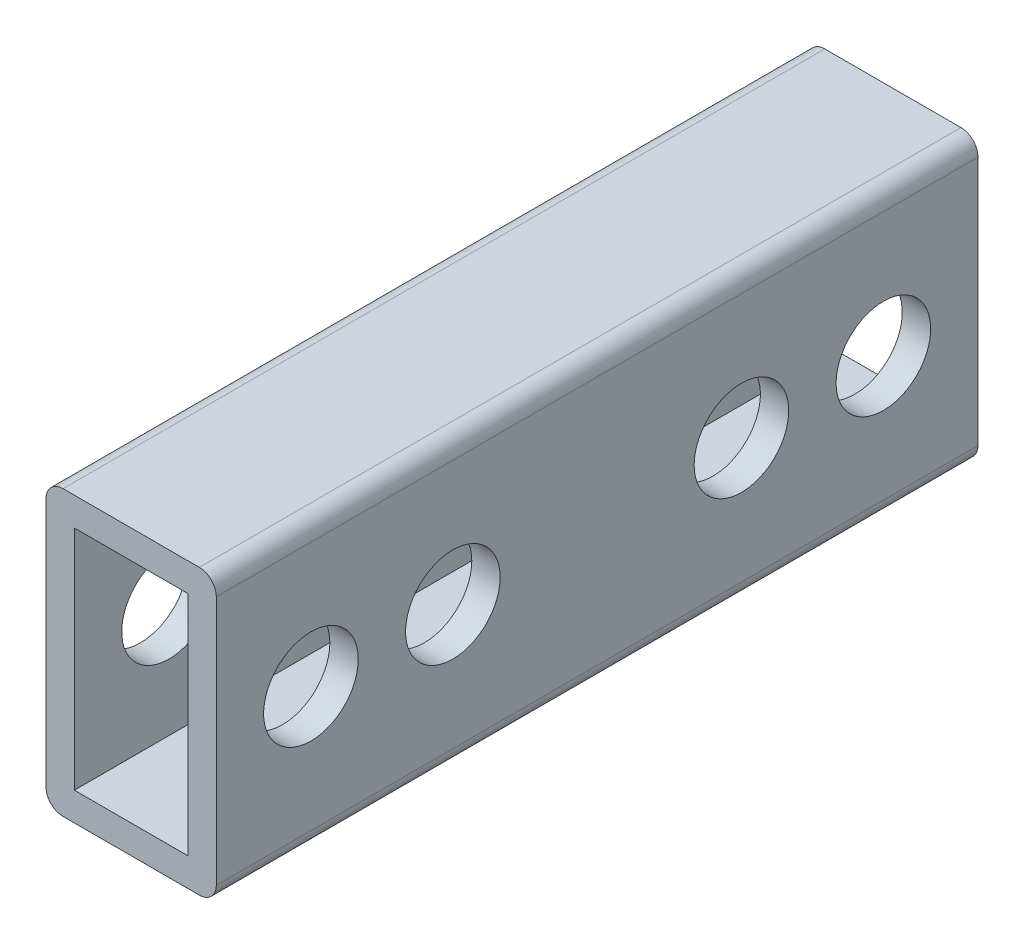
ISO-10303-21;
HEADER;
FILE_DESCRIPTION(('STEP AP214'),'2;1');
FILE_NAME('part.step','',(''),(''),'','','');
FILE_SCHEMA(('AUTOMOTIVE_DESIGN { 1 0 10303 214 1 1 1 1 }'));
ENDSEC;
DATA;
#1=APPLICATION_CONTEXT('core data for automotive mechanical design processes');
#2=APPLICATION_PROTOCOL_DEFINITION('international standard','automotive_design',2000,#1);
#3=PRODUCT_CONTEXT('',#1,'mechanical');
#4=PRODUCT('Part','Part','',(#3));
#5=PRODUCT_RELATED_PRODUCT_CATEGORY('part','',(#4));
#6=PRODUCT_DEFINITION_FORMATION('','',#4);
#7=PRODUCT_DEFINITION_CONTEXT('part definition',#1,'design');
#8=PRODUCT_DEFINITION('design','',#6,#7);
#9=PRODUCT_DEFINITION_SHAPE('','',#8);
#10=(LENGTH_UNIT() NAMED_UNIT(*) SI_UNIT(.MILLI.,.METRE.));
#11=(NAMED_UNIT(*) PLANE_ANGLE_UNIT() SI_UNIT($,.RADIAN.));
#12=(NAMED_UNIT(*) SI_UNIT($,.STERADIAN.) SOLID_ANGLE_UNIT());
#13=UNCERTAINTY_MEASURE_WITH_UNIT(LENGTH_MEASURE(1.E-05),#10,'distance_accuracy_value','');
#14=(GEOMETRIC_REPRESENTATION_CONTEXT(3) GLOBAL_UNCERTAINTY_ASSIGNED_CONTEXT((#13)) GLOBAL_UNIT_ASSIGNED_CONTEXT((#10,
#11,#12)) REPRESENTATION_CONTEXT('',''));
#15=CARTESIAN_POINT('',(0.,0.,0.));
#16=DIRECTION('',(0.,0.,1.));
#17=DIRECTION('',(1.,0.,0.));
#18=AXIS2_PLACEMENT_3D('',#15,#16,#17);
#19=CARTESIAN_POINT('',(0.,0.,80.5));
#20=DIRECTION('',(0.,0.,1.));
#21=DIRECTION('',(1.,0.,0.));
#22=AXIS2_PLACEMENT_3D('',#19,#20,#21);
#23=PLANE('',#22);
#24=DIRECTION('',(0.,-1.,0.));
#25=VECTOR('',#24,1.);
#26=CARTESIAN_POINT('',(-9.,-15.,80.5));
#27=LINE('',#26,#25);
#28=CARTESIAN_POINT('',(-9.,13.2,80.5));
#29=VERTEX_POINT('',#28);
#30=CARTESIAN_POINT('',(-9.,-13.2,80.5));
#31=VERTEX_POINT('',#30);
#32=EDGE_CURVE('E170',#29,#31,#27,.T.);
#33=ORIENTED_EDGE('',*,*,#32,.T.);
#34=CARTESIAN_POINT('',(-7.2,-13.2,80.5));
#35=DIRECTION('',(0.,0.,1.));
#36=DIRECTION('',(1.,0.,0.));
#37=AXIS2_PLACEMENT_3D('',#34,#35,#36);
#38=CIRCLE('',#37,1.8);
#39=CARTESIAN_POINT('',(-7.2,-15.,80.5));
#40=VERTEX_POINT('',#39);
#41=EDGE_CURVE('E229',#31,#40,#38,.T.);
#42=ORIENTED_EDGE('',*,*,#41,.T.);
#43=DIRECTION('',(1.,0.,0.));
#44=VECTOR('',#43,1.);
#45=CARTESIAN_POINT('',(9.,-15.,80.5));
#46=LINE('',#45,#44);
#47=CARTESIAN_POINT('',(7.2,-15.,80.5));
#48=VERTEX_POINT('',#47);
#49=EDGE_CURVE('E173',#40,#48,#46,.T.);
#50=ORIENTED_EDGE('',*,*,#49,.T.);
#51=CARTESIAN_POINT('',(7.2,-13.2,80.5));
#52=DIRECTION('',(0.,0.,1.));
#53=DIRECTION('',(1.,0.,0.));
#54=AXIS2_PLACEMENT_3D('',#51,#52,#53);
#55=CIRCLE('',#54,1.8);
#56=CARTESIAN_POINT('',(9.,-13.2,80.5));
#57=VERTEX_POINT('',#56);
#58=EDGE_CURVE('E227',#48,#57,#55,.T.);
#59=ORIENTED_EDGE('',*,*,#58,.T.);
#60=DIRECTION('',(0.,1.,0.));
#61=VECTOR('',#60,1.);
#62=CARTESIAN_POINT('',(9.,-15.,80.5));
#63=LINE('',#62,#61);
#64=CARTESIAN_POINT('',(9.,13.2,80.5));
#65=VERTEX_POINT('',#64);
#66=EDGE_CURVE('E177',#57,#65,#63,.T.);
#67=ORIENTED_EDGE('',*,*,#66,.T.);
#68=CARTESIAN_POINT('',(7.2,13.2,80.5));
#69=DIRECTION('',(0.,0.,1.));
#70=DIRECTION('',(1.,0.,0.));
#71=AXIS2_PLACEMENT_3D('',#68,#69,#70);
#72=CIRCLE('',#71,1.8);
#73=CARTESIAN_POINT('',(7.2,15.,80.5));
#74=VERTEX_POINT('',#73);
#75=EDGE_CURVE('E57',#65,#74,#72,.T.);
#76=ORIENTED_EDGE('',*,*,#75,.T.);
#77=DIRECTION('',(-1.,0.,0.));
#78=VECTOR('',#77,1.);
#79=CARTESIAN_POINT('',(9.,15.,80.5));
#80=LINE('',#79,#78);
#81=CARTESIAN_POINT('',(-7.2,15.,80.5));
#82=VERTEX_POINT('',#81);
#83=EDGE_CURVE('E179',#74,#82,#80,.T.);
#84=ORIENTED_EDGE('',*,*,#83,.T.);
#85=CARTESIAN_POINT('',(-7.2,13.2,80.5));
#86=DIRECTION('',(0.,0.,1.));
#87=DIRECTION('',(1.,0.,0.));
#88=AXIS2_PLACEMENT_3D('',#85,#86,#87);
#89=CIRCLE('',#88,1.8);
#90=EDGE_CURVE('E224',#82,#29,#89,.T.);
#91=ORIENTED_EDGE('',*,*,#90,.T.);
#92=EDGE_LOOP('',(#33,#42,#50,#59,#67,#76,#84,#91));
#93=FACE_BOUND('',#92,.T.);
#94=DIRECTION('',(1.,0.,0.));
#95=VECTOR('',#94,1.);
#96=CARTESIAN_POINT('',(6.,-12.,80.5));
#97=LINE('',#96,#95);
#98=CARTESIAN_POINT('',(-6.,-12.,80.5));
#99=VERTEX_POINT('',#98);
#100=CARTESIAN_POINT('',(6.,-12.,80.5));
#101=VERTEX_POINT('',#100);
#102=EDGE_CURVE('E137',#99,#101,#97,.T.);
#103=ORIENTED_EDGE('',*,*,#102,.F.);
#104=DIRECTION('',(0.,-1.,0.));
#105=VECTOR('',#104,1.);
#106=CARTESIAN_POINT('',(-6.,-12.,80.5));
#107=LINE('',#106,#105);
#108=CARTESIAN_POINT('',(-6.,12.,80.5));
#109=VERTEX_POINT('',#108);
#110=EDGE_CURVE('E127',#109,#99,#107,.T.);
#111=ORIENTED_EDGE('',*,*,#110,.F.);
#112=DIRECTION('',(-1.,0.,0.));
#113=VECTOR('',#112,1.);
#114=CARTESIAN_POINT('',(6.,12.,80.5));
#115=LINE('',#114,#113);
#116=CARTESIAN_POINT('',(6.,12.,80.5));
#117=VERTEX_POINT('',#116);
#118=EDGE_CURVE('E152',#117,#109,#115,.T.);
#119=ORIENTED_EDGE('',*,*,#118,.F.);
#120=DIRECTION('',(0.,1.,0.));
#121=VECTOR('',#120,1.);
#122=CARTESIAN_POINT('',(6.,-12.,80.5));
#123=LINE('',#122,#121);
#124=EDGE_CURVE('E150',#101,#117,#123,.T.);
#125=ORIENTED_EDGE('',*,*,#124,.F.);
#126=EDGE_LOOP('',(#103,#111,#119,#125));
#127=FACE_BOUND('',#126,.T.);
#128=ADVANCED_FACE('F36',(#93,#127),#23,.T.);
#129=CARTESIAN_POINT('',(0.,0.,0.));
#130=DIRECTION('',(0.,0.,1.));
#131=DIRECTION('',(1.,0.,0.));
#132=AXIS2_PLACEMENT_3D('',#129,#130,#131);
#133=PLANE('',#132);
#134=DIRECTION('',(1.,0.,0.));
#135=VECTOR('',#134,1.);
#136=CARTESIAN_POINT('',(9.,-15.,0.));
#137=LINE('',#136,#135);
#138=CARTESIAN_POINT('',(-7.2,-15.,0.));
#139=VERTEX_POINT('',#138);
#140=CARTESIAN_POINT('',(7.2,-15.,0.));
#141=VERTEX_POINT('',#140);
#142=EDGE_CURVE('E184',#139,#141,#137,.T.);
#143=ORIENTED_EDGE('',*,*,#142,.F.);
#144=CARTESIAN_POINT('',(-7.2,-13.2,0.));
#145=DIRECTION('',(0.,0.,1.));
#146=DIRECTION('',(1.,0.,0.));
#147=AXIS2_PLACEMENT_3D('',#144,#145,#146);
#148=CIRCLE('',#147,1.8);
#149=CARTESIAN_POINT('',(-9.,-13.2,0.));
#150=VERTEX_POINT('',#149);
#151=EDGE_CURVE('E217',#139,#150,#148,.F.);
#152=ORIENTED_EDGE('',*,*,#151,.T.);
#153=DIRECTION('',(0.,-1.,0.));
#154=VECTOR('',#153,1.);
#155=CARTESIAN_POINT('',(-9.,-15.,0.));
#156=LINE('',#155,#154);
#157=CARTESIAN_POINT('',(-9.,13.2,0.));
#158=VERTEX_POINT('',#157);
#159=EDGE_CURVE('E145',#158,#150,#156,.T.);
#160=ORIENTED_EDGE('',*,*,#159,.F.);
#161=CARTESIAN_POINT('',(-7.2,13.2,0.));
#162=DIRECTION('',(0.,0.,1.));
#163=DIRECTION('',(1.,0.,0.));
#164=AXIS2_PLACEMENT_3D('',#161,#162,#163);
#165=CIRCLE('',#164,1.8);
#166=CARTESIAN_POINT('',(-7.2,15.,0.));
#167=VERTEX_POINT('',#166);
#168=EDGE_CURVE('E211',#158,#167,#165,.F.);
#169=ORIENTED_EDGE('',*,*,#168,.T.);
#170=DIRECTION('',(-1.,0.,0.));
#171=VECTOR('',#170,1.);
#172=CARTESIAN_POINT('',(9.,15.,0.));
#173=LINE('',#172,#171);
#174=CARTESIAN_POINT('',(7.2,15.,0.));
#175=VERTEX_POINT('',#174);
#176=EDGE_CURVE('E174',#175,#167,#173,.T.);
#177=ORIENTED_EDGE('',*,*,#176,.F.);
#178=CARTESIAN_POINT('',(7.2,13.2,0.));
#179=DIRECTION('',(0.,0.,1.));
#180=DIRECTION('',(1.,0.,0.));
#181=AXIS2_PLACEMENT_3D('',#178,#179,#180);
#182=CIRCLE('',#181,1.8);
#183=CARTESIAN_POINT('',(9.,13.2,0.));
#184=VERTEX_POINT('',#183);
#185=EDGE_CURVE('E213',#175,#184,#182,.F.);
#186=ORIENTED_EDGE('',*,*,#185,.T.);
#187=DIRECTION('',(0.,1.,0.));
#188=VECTOR('',#187,1.);
#189=CARTESIAN_POINT('',(9.,-15.,0.));
#190=LINE('',#189,#188);
#191=CARTESIAN_POINT('',(9.,-13.2,0.));
#192=VERTEX_POINT('',#191);
#193=EDGE_CURVE('E187',#192,#184,#190,.T.);
#194=ORIENTED_EDGE('',*,*,#193,.F.);
#195=CARTESIAN_POINT('',(7.2,-13.2,0.));
#196=DIRECTION('',(0.,0.,1.));
#197=DIRECTION('',(1.,0.,0.));
#198=AXIS2_PLACEMENT_3D('',#195,#196,#197);
#199=CIRCLE('',#198,1.8);
#200=EDGE_CURVE('E215',#192,#141,#199,.F.);
#201=ORIENTED_EDGE('',*,*,#200,.T.);
#202=EDGE_LOOP('',(#143,#152,#160,#169,#177,#186,#194,#201));
#203=FACE_BOUND('',#202,.T.);
#204=DIRECTION('',(0.,-1.,0.));
#205=VECTOR('',#204,1.);
#206=CARTESIAN_POINT('',(-6.,-12.,0.));
#207=LINE('',#206,#205);
#208=CARTESIAN_POINT('',(-6.,12.,0.));
#209=VERTEX_POINT('',#208);
#210=CARTESIAN_POINT('',(-6.,-12.,0.));
#211=VERTEX_POINT('',#210);
#212=EDGE_CURVE('E157',#209,#211,#207,.T.);
#213=ORIENTED_EDGE('',*,*,#212,.T.);
#214=DIRECTION('',(1.,0.,0.));
#215=VECTOR('',#214,1.);
#216=CARTESIAN_POINT('',(6.,-12.,0.));
#217=LINE('',#216,#215);
#218=CARTESIAN_POINT('',(6.,-12.,0.));
#219=VERTEX_POINT('',#218);
#220=EDGE_CURVE('E144',#211,#219,#217,.T.);
#221=ORIENTED_EDGE('',*,*,#220,.T.);
#222=DIRECTION('',(0.,1.,0.));
#223=VECTOR('',#222,1.);
#224=CARTESIAN_POINT('',(6.,-12.,0.));
#225=LINE('',#224,#223);
#226=CARTESIAN_POINT('',(6.,12.,0.));
#227=VERTEX_POINT('',#226);
#228=EDGE_CURVE('E161',#219,#227,#225,.T.);
#229=ORIENTED_EDGE('',*,*,#228,.T.);
#230=DIRECTION('',(-1.,0.,0.));
#231=VECTOR('',#230,1.);
#232=CARTESIAN_POINT('',(6.,12.,0.));
#233=LINE('',#232,#231);
#234=EDGE_CURVE('E138',#227,#209,#233,.T.);
#235=ORIENTED_EDGE('',*,*,#234,.T.);
#236=EDGE_LOOP('',(#213,#221,#229,#235));
#237=FACE_BOUND('',#236,.T.);
#238=ADVANCED_FACE('F245',(#203,#237),#133,.F.);
#239=CARTESIAN_POINT('',(-9.,-15.,80.5));
#240=DIRECTION('',(1.,0.,0.));
#241=DIRECTION('',(0.,0.,-1.));
#242=AXIS2_PLACEMENT_3D('',#239,#240,#241);
#243=PLANE('',#242);
#244=CARTESIAN_POINT('',(-9.,0.,70.5));
#245=DIRECTION('',(1.,0.,0.));
#246=DIRECTION('',(0.,0.,-1.));
#247=AXIS2_PLACEMENT_3D('',#244,#245,#246);
#248=CIRCLE('',#247,4.99999999999999);
#249=CARTESIAN_POINT('',(-9.,0.,65.5));
#250=VERTEX_POINT('',#249);
#251=EDGE_CURVE('E195',#250,#250,#248,.T.);
#252=ORIENTED_EDGE('',*,*,#251,.T.);
#253=EDGE_LOOP('',(#252));
#254=FACE_BOUND('',#253,.T.);
#255=CARTESIAN_POINT('',(-9.,0.,55.5));
#256=DIRECTION('',(1.,0.,0.));
#257=DIRECTION('',(0.,0.,-1.));
#258=AXIS2_PLACEMENT_3D('',#255,#256,#257);
#259=CIRCLE('',#258,4.99999999999999);
#260=CARTESIAN_POINT('',(-9.,0.,50.5));
#261=VERTEX_POINT('',#260);
#262=EDGE_CURVE('E303',#261,#261,#259,.T.);
#263=ORIENTED_EDGE('',*,*,#262,.T.);
#264=EDGE_LOOP('',(#263));
#265=FACE_BOUND('',#264,.T.);
#266=CARTESIAN_POINT('',(-9.,0.,25.));
#267=DIRECTION('',(1.,0.,0.));
#268=DIRECTION('',(0.,0.,1.));
#269=AXIS2_PLACEMENT_3D('',#266,#267,#268);
#270=CIRCLE('',#269,4.99999999999999);
#271=CARTESIAN_POINT('',(-9.,0.,30.));
#272=VERTEX_POINT('',#271);
#273=EDGE_CURVE('E307',#272,#272,#270,.T.);
#274=ORIENTED_EDGE('',*,*,#273,.T.);
#275=EDGE_LOOP('',(#274));
#276=FACE_BOUND('',#275,.T.);
#277=CARTESIAN_POINT('',(-9.,0.,10.));
#278=DIRECTION('',(1.,0.,0.));
#279=DIRECTION('',(0.,0.,1.));
#280=AXIS2_PLACEMENT_3D('',#277,#278,#279);
#281=CIRCLE('',#280,4.99999999999999);
#282=CARTESIAN_POINT('',(-9.,0.,15.));
#283=VERTEX_POINT('',#282);
#284=EDGE_CURVE('E310',#283,#283,#281,.T.);
#285=ORIENTED_EDGE('',*,*,#284,.T.);
#286=EDGE_LOOP('',(#285));
#287=FACE_BOUND('',#286,.T.);
#288=ORIENTED_EDGE('',*,*,#159,.T.);
#289=DIRECTION('',(0.,0.,-1.));
#290=VECTOR('',#289,1.);
#291=CARTESIAN_POINT('',(-9.,-13.2,80.5));
#292=LINE('',#291,#290);
#293=EDGE_CURVE('E222',#150,#31,#292,.F.);
#294=ORIENTED_EDGE('',*,*,#293,.T.);
#295=ORIENTED_EDGE('',*,*,#32,.F.);
#296=DIRECTION('',(0.,0.,-1.));
#297=VECTOR('',#296,1.);
#298=CARTESIAN_POINT('',(-9.,13.2,80.5));
#299=LINE('',#298,#297);
#300=EDGE_CURVE('E219',#29,#158,#299,.T.);
#301=ORIENTED_EDGE('',*,*,#300,.T.);
#302=EDGE_LOOP('',(#288,#294,#295,#301));
#303=FACE_BOUND('',#302,.T.);
#304=ADVANCED_FACE('F258',(#254,#265,#276,#287,#303),#243,.F.);
#305=CARTESIAN_POINT('',(9.,-15.,80.5));
#306=DIRECTION('',(0.,1.,0.));
#307=DIRECTION('',(0.,0.,1.));
#308=AXIS2_PLACEMENT_3D('',#305,#306,#307);
#309=PLANE('',#308);
#310=ORIENTED_EDGE('',*,*,#49,.F.);
#311=DIRECTION('',(0.,0.,-1.));
#312=VECTOR('',#311,1.);
#313=CARTESIAN_POINT('',(-7.2,-15.,80.5));
#314=LINE('',#313,#312);
#315=EDGE_CURVE('E208',#40,#139,#314,.T.);
#316=ORIENTED_EDGE('',*,*,#315,.T.);
#317=ORIENTED_EDGE('',*,*,#142,.T.);
#318=DIRECTION('',(0.,0.,-1.));
#319=VECTOR('',#318,1.);
#320=CARTESIAN_POINT('',(7.2,-15.,80.5));
#321=LINE('',#320,#319);
#322=EDGE_CURVE('E181',#141,#48,#321,.F.);
#323=ORIENTED_EDGE('',*,*,#322,.T.);
#324=EDGE_LOOP('',(#310,#316,#317,#323));
#325=FACE_BOUND('',#324,.T.);
#326=ADVANCED_FACE('F266',(#325),#309,.F.);
#327=CARTESIAN_POINT('',(9.,-15.,80.5));
#328=DIRECTION('',(-1.,0.,0.));
#329=DIRECTION('',(0.,0.,1.));
#330=AXIS2_PLACEMENT_3D('',#327,#328,#329);
#331=PLANE('',#330);
#332=CARTESIAN_POINT('',(9.,0.,70.5));
#333=DIRECTION('',(1.,0.,0.));
#334=DIRECTION('',(0.,0.,-1.));
#335=AXIS2_PLACEMENT_3D('',#332,#333,#334);
#336=CIRCLE('',#335,4.99999999999999);
#337=CARTESIAN_POINT('',(9.,0.,65.5));
#338=VERTEX_POINT('',#337);
#339=EDGE_CURVE('E394',#338,#338,#336,.T.);
#340=ORIENTED_EDGE('',*,*,#339,.F.);
#341=EDGE_LOOP('',(#340));
#342=FACE_BOUND('',#341,.T.);
#343=CARTESIAN_POINT('',(9.,0.,55.5));
#344=DIRECTION('',(1.,0.,0.));
#345=DIRECTION('',(0.,0.,-1.));
#346=AXIS2_PLACEMENT_3D('',#343,#344,#345);
#347=CIRCLE('',#346,4.99999999999999);
#348=CARTESIAN_POINT('',(9.,0.,50.5));
#349=VERTEX_POINT('',#348);
#350=EDGE_CURVE('E389',#349,#349,#347,.T.);
#351=ORIENTED_EDGE('',*,*,#350,.F.);
#352=EDGE_LOOP('',(#351));
#353=FACE_BOUND('',#352,.T.);
#354=CARTESIAN_POINT('',(9.,0.,25.));
#355=DIRECTION('',(1.,0.,0.));
#356=DIRECTION('',(0.,0.,1.));
#357=AXIS2_PLACEMENT_3D('',#354,#355,#356);
#358=CIRCLE('',#357,4.99999999999999);
#359=CARTESIAN_POINT('',(9.,0.,30.));
#360=VERTEX_POINT('',#359);
#361=EDGE_CURVE('E386',#360,#360,#358,.T.);
#362=ORIENTED_EDGE('',*,*,#361,.F.);
#363=EDGE_LOOP('',(#362));
#364=FACE_BOUND('',#363,.T.);
#365=CARTESIAN_POINT('',(9.,0.,10.));
#366=DIRECTION('',(1.,0.,0.));
#367=DIRECTION('',(0.,0.,1.));
#368=AXIS2_PLACEMENT_3D('',#365,#366,#367);
#369=CIRCLE('',#368,4.99999999999999);
#370=CARTESIAN_POINT('',(9.,0.,15.));
#371=VERTEX_POINT('',#370);
#372=EDGE_CURVE('E312',#371,#371,#369,.T.);
#373=ORIENTED_EDGE('',*,*,#372,.F.);
#374=EDGE_LOOP('',(#373));
#375=FACE_BOUND('',#374,.T.);
#376=ORIENTED_EDGE('',*,*,#66,.F.);
#377=DIRECTION('',(0.,0.,-1.));
#378=VECTOR('',#377,1.);
#379=CARTESIAN_POINT('',(9.,-13.2,80.5));
#380=LINE('',#379,#378);
#381=EDGE_CURVE('E233',#57,#192,#380,.T.);
#382=ORIENTED_EDGE('',*,*,#381,.T.);
#383=ORIENTED_EDGE('',*,*,#193,.T.);
#384=DIRECTION('',(0.,0.,-1.));
#385=VECTOR('',#384,1.);
#386=CARTESIAN_POINT('',(9.,13.2,80.5));
#387=LINE('',#386,#385);
#388=EDGE_CURVE('E231',#184,#65,#387,.F.);
#389=ORIENTED_EDGE('',*,*,#388,.T.);
#390=EDGE_LOOP('',(#376,#382,#383,#389));
#391=FACE_BOUND('',#390,.T.);
#392=ADVANCED_FACE('F239',(#342,#353,#364,#375,#391),#331,.F.);
#393=CARTESIAN_POINT('',(9.,15.,80.5));
#394=DIRECTION('',(0.,-1.,0.));
#395=DIRECTION('',(0.,0.,-1.));
#396=AXIS2_PLACEMENT_3D('',#393,#394,#395);
#397=PLANE('',#396);
#398=ORIENTED_EDGE('',*,*,#83,.F.);
#399=DIRECTION('',(0.,0.,-1.));
#400=VECTOR('',#399,1.);
#401=CARTESIAN_POINT('',(7.2,15.,80.5));
#402=LINE('',#401,#400);
#403=EDGE_CURVE('E11',#74,#175,#402,.T.);
#404=ORIENTED_EDGE('',*,*,#403,.T.);
#405=ORIENTED_EDGE('',*,*,#176,.T.);
#406=DIRECTION('',(0.,0.,-1.));
#407=VECTOR('',#406,1.);
#408=CARTESIAN_POINT('',(-7.2,15.,80.5));
#409=LINE('',#408,#407);
#410=EDGE_CURVE('E44',#167,#82,#409,.F.);
#411=ORIENTED_EDGE('',*,*,#410,.T.);
#412=EDGE_LOOP('',(#398,#404,#405,#411));
#413=FACE_BOUND('',#412,.T.);
#414=ADVANCED_FACE('F251',(#413),#397,.F.);
#415=CARTESIAN_POINT('',(-6.,-12.,80.5));
#416=DIRECTION('',(1.,0.,0.));
#417=DIRECTION('',(0.,0.,-1.));
#418=AXIS2_PLACEMENT_3D('',#415,#416,#417);
#419=PLANE('',#418);
#420=CARTESIAN_POINT('',(-6.,0.,70.5));
#421=DIRECTION('',(1.,0.,0.));
#422=DIRECTION('',(0.,0.,-1.));
#423=AXIS2_PLACEMENT_3D('',#420,#421,#422);
#424=CIRCLE('',#423,4.99999999999999);
#425=CARTESIAN_POINT('',(-6.,0.,65.5));
#426=VERTEX_POINT('',#425);
#427=EDGE_CURVE('E159',#426,#426,#424,.T.);
#428=ORIENTED_EDGE('',*,*,#427,.F.);
#429=EDGE_LOOP('',(#428));
#430=FACE_BOUND('',#429,.T.);
#431=CARTESIAN_POINT('',(-6.,0.,55.5));
#432=DIRECTION('',(1.,0.,0.));
#433=DIRECTION('',(0.,0.,-1.));
#434=AXIS2_PLACEMENT_3D('',#431,#432,#433);
#435=CIRCLE('',#434,4.99999999999999);
#436=CARTESIAN_POINT('',(-6.,0.,50.5));
#437=VERTEX_POINT('',#436);
#438=EDGE_CURVE('E203',#437,#437,#435,.T.);
#439=ORIENTED_EDGE('',*,*,#438,.F.);
#440=EDGE_LOOP('',(#439));
#441=FACE_BOUND('',#440,.T.);
#442=CARTESIAN_POINT('',(-6.,0.,25.));
#443=DIRECTION('',(1.,0.,0.));
#444=DIRECTION('',(0.,0.,-1.));
#445=AXIS2_PLACEMENT_3D('',#442,#443,#444);
#446=CIRCLE('',#445,4.99999999999999);
#447=CARTESIAN_POINT('',(-6.,0.,20.));
#448=VERTEX_POINT('',#447);
#449=EDGE_CURVE('E199',#448,#448,#446,.T.);
#450=ORIENTED_EDGE('',*,*,#449,.F.);
#451=EDGE_LOOP('',(#450));
#452=FACE_BOUND('',#451,.T.);
#453=CARTESIAN_POINT('',(-6.,0.,10.));
#454=DIRECTION('',(1.,0.,0.));
#455=DIRECTION('',(0.,0.,-1.));
#456=AXIS2_PLACEMENT_3D('',#453,#454,#455);
#457=CIRCLE('',#456,4.99999999999999);
#458=CARTESIAN_POINT('',(-6.,0.,5.00000000000002));
#459=VERTEX_POINT('',#458);
#460=EDGE_CURVE('E194',#459,#459,#457,.T.);
#461=ORIENTED_EDGE('',*,*,#460,.F.);
#462=EDGE_LOOP('',(#461));
#463=FACE_BOUND('',#462,.T.);
#464=ORIENTED_EDGE('',*,*,#212,.F.);
#465=DIRECTION('',(0.,0.,-1.));
#466=VECTOR('',#465,1.);
#467=CARTESIAN_POINT('',(-6.,12.,80.5));
#468=LINE('',#467,#466);
#469=EDGE_CURVE('E133',#109,#209,#468,.T.);
#470=ORIENTED_EDGE('',*,*,#469,.F.);
#471=ORIENTED_EDGE('',*,*,#110,.T.);
#472=DIRECTION('',(0.,0.,-1.));
#473=VECTOR('',#472,1.);
#474=CARTESIAN_POINT('',(-6.,-12.,80.5));
#475=LINE('',#474,#473);
#476=EDGE_CURVE('E130',#99,#211,#475,.T.);
#477=ORIENTED_EDGE('',*,*,#476,.T.);
#478=EDGE_LOOP('',(#464,#470,#471,#477));
#479=FACE_BOUND('',#478,.T.);
#480=ADVANCED_FACE('F129',(#430,#441,#452,#463,#479),#419,.T.);
#481=CARTESIAN_POINT('',(6.,-12.,80.5));
#482=DIRECTION('',(0.,1.,0.));
#483=DIRECTION('',(0.,0.,1.));
#484=AXIS2_PLACEMENT_3D('',#481,#482,#483);
#485=PLANE('',#484);
#486=ORIENTED_EDGE('',*,*,#220,.F.);
#487=ORIENTED_EDGE('',*,*,#476,.F.);
#488=ORIENTED_EDGE('',*,*,#102,.T.);
#489=DIRECTION('',(0.,0.,-1.));
#490=VECTOR('',#489,1.);
#491=CARTESIAN_POINT('',(6.,-12.,80.5));
#492=LINE('',#491,#490);
#493=EDGE_CURVE('E146',#101,#219,#492,.T.);
#494=ORIENTED_EDGE('',*,*,#493,.T.);
#495=EDGE_LOOP('',(#486,#487,#488,#494));
#496=FACE_BOUND('',#495,.T.);
#497=ADVANCED_FACE('F141',(#496),#485,.T.);
#498=CARTESIAN_POINT('',(6.,-12.,80.5));
#499=DIRECTION('',(-1.,0.,0.));
#500=DIRECTION('',(0.,0.,1.));
#501=AXIS2_PLACEMENT_3D('',#498,#499,#500);
#502=PLANE('',#501);
#503=CARTESIAN_POINT('',(6.,0.,70.5));
#504=DIRECTION('',(-1.,0.,0.));
#505=DIRECTION('',(0.,0.,1.));
#506=AXIS2_PLACEMENT_3D('',#503,#504,#505);
#507=CIRCLE('',#506,4.99999999999999);
#508=CARTESIAN_POINT('',(6.,0.,75.5));
#509=VERTEX_POINT('',#508);
#510=EDGE_CURVE('E204',#509,#509,#507,.T.);
#511=ORIENTED_EDGE('',*,*,#510,.F.);
#512=EDGE_LOOP('',(#511));
#513=FACE_BOUND('',#512,.T.);
#514=CARTESIAN_POINT('',(6.,0.,55.5));
#515=DIRECTION('',(-1.,0.,0.));
#516=DIRECTION('',(0.,0.,1.));
#517=AXIS2_PLACEMENT_3D('',#514,#515,#516);
#518=CIRCLE('',#517,4.99999999999999);
#519=CARTESIAN_POINT('',(6.,0.,60.5));
#520=VERTEX_POINT('',#519);
#521=EDGE_CURVE('E200',#520,#520,#518,.T.);
#522=ORIENTED_EDGE('',*,*,#521,.F.);
#523=EDGE_LOOP('',(#522));
#524=FACE_BOUND('',#523,.T.);
#525=CARTESIAN_POINT('',(6.,0.,25.));
#526=DIRECTION('',(-1.,0.,0.));
#527=DIRECTION('',(0.,0.,1.));
#528=AXIS2_PLACEMENT_3D('',#525,#526,#527);
#529=CIRCLE('',#528,4.99999999999999);
#530=CARTESIAN_POINT('',(6.,0.,30.));
#531=VERTEX_POINT('',#530);
#532=EDGE_CURVE('E196',#531,#531,#529,.T.);
#533=ORIENTED_EDGE('',*,*,#532,.F.);
#534=EDGE_LOOP('',(#533));
#535=FACE_BOUND('',#534,.T.);
#536=CARTESIAN_POINT('',(6.,0.,10.));
#537=DIRECTION('',(-1.,0.,0.));
#538=DIRECTION('',(0.,0.,1.));
#539=AXIS2_PLACEMENT_3D('',#536,#537,#538);
#540=CIRCLE('',#539,4.99999999999999);
#541=CARTESIAN_POINT('',(6.,0.,15.));
#542=VERTEX_POINT('',#541);
#543=EDGE_CURVE('E191',#542,#542,#540,.T.);
#544=ORIENTED_EDGE('',*,*,#543,.F.);
#545=EDGE_LOOP('',(#544));
#546=FACE_BOUND('',#545,.T.);
#547=ORIENTED_EDGE('',*,*,#228,.F.);
#548=ORIENTED_EDGE('',*,*,#493,.F.);
#549=ORIENTED_EDGE('',*,*,#124,.T.);
#550=DIRECTION('',(0.,0.,-1.));
#551=VECTOR('',#550,1.);
#552=CARTESIAN_POINT('',(6.,12.,80.5));
#553=LINE('',#552,#551);
#554=EDGE_CURVE('E167',#117,#227,#553,.T.);
#555=ORIENTED_EDGE('',*,*,#554,.T.);
#556=EDGE_LOOP('',(#547,#548,#549,#555));
#557=FACE_BOUND('',#556,.T.);
#558=ADVANCED_FACE('F362',(#513,#524,#535,#546,#557),#502,.T.);
#559=CARTESIAN_POINT('',(6.,12.,80.5));
#560=DIRECTION('',(0.,-1.,0.));
#561=DIRECTION('',(0.,0.,-1.));
#562=AXIS2_PLACEMENT_3D('',#559,#560,#561);
#563=PLANE('',#562);
#564=ORIENTED_EDGE('',*,*,#234,.F.);
#565=ORIENTED_EDGE('',*,*,#554,.F.);
#566=ORIENTED_EDGE('',*,*,#118,.T.);
#567=ORIENTED_EDGE('',*,*,#469,.T.);
#568=EDGE_LOOP('',(#564,#565,#566,#567));
#569=FACE_BOUND('',#568,.T.);
#570=ADVANCED_FACE('F355',(#569),#563,.T.);
#571=CARTESIAN_POINT('',(-9.,0.,10.));
#572=DIRECTION('',(1.,0.,0.));
#573=DIRECTION('',(0.,0.,-1.));
#574=AXIS2_PLACEMENT_3D('',#571,#572,#573);
#575=CYLINDRICAL_SURFACE('',#574,4.99999999999999);
#576=ORIENTED_EDGE('',*,*,#543,.T.);
#577=EDGE_LOOP('',(#576));
#578=FACE_BOUND('',#577,.T.);
#579=ORIENTED_EDGE('',*,*,#372,.T.);
#580=EDGE_LOOP('',(#579));
#581=FACE_BOUND('',#580,.T.);
#582=ADVANCED_FACE('F341',(#578,#581),#575,.F.);
#583=CARTESIAN_POINT('',(-9.,0.,25.));
#584=DIRECTION('',(1.,0.,0.));
#585=DIRECTION('',(0.,0.,-1.));
#586=AXIS2_PLACEMENT_3D('',#583,#584,#585);
#587=CYLINDRICAL_SURFACE('',#586,4.99999999999999);
#588=ORIENTED_EDGE('',*,*,#532,.T.);
#589=EDGE_LOOP('',(#588));
#590=FACE_BOUND('',#589,.T.);
#591=ORIENTED_EDGE('',*,*,#361,.T.);
#592=EDGE_LOOP('',(#591));
#593=FACE_BOUND('',#592,.T.);
#594=ADVANCED_FACE('F349',(#590,#593),#587,.F.);
#595=CARTESIAN_POINT('',(-9.,0.,55.5));
#596=DIRECTION('',(1.,0.,0.));
#597=DIRECTION('',(0.,0.,-1.));
#598=AXIS2_PLACEMENT_3D('',#595,#596,#597);
#599=CYLINDRICAL_SURFACE('',#598,4.99999999999999);
#600=ORIENTED_EDGE('',*,*,#521,.T.);
#601=EDGE_LOOP('',(#600));
#602=FACE_BOUND('',#601,.T.);
#603=ORIENTED_EDGE('',*,*,#350,.T.);
#604=EDGE_LOOP('',(#603));
#605=FACE_BOUND('',#604,.T.);
#606=ADVANCED_FACE('F350',(#602,#605),#599,.F.);
#607=CARTESIAN_POINT('',(-9.,0.,70.5));
#608=DIRECTION('',(1.,0.,0.));
#609=DIRECTION('',(0.,0.,-1.));
#610=AXIS2_PLACEMENT_3D('',#607,#608,#609);
#611=CYLINDRICAL_SURFACE('',#610,4.99999999999999);
#612=ORIENTED_EDGE('',*,*,#510,.T.);
#613=EDGE_LOOP('',(#612));
#614=FACE_BOUND('',#613,.T.);
#615=ORIENTED_EDGE('',*,*,#339,.T.);
#616=EDGE_LOOP('',(#615));
#617=FACE_BOUND('',#616,.T.);
#618=ADVANCED_FACE('F339',(#614,#617),#611,.F.);
#619=ORIENTED_EDGE('',*,*,#460,.T.);
#620=EDGE_LOOP('',(#619));
#621=FACE_BOUND('',#620,.T.);
#622=ORIENTED_EDGE('',*,*,#284,.F.);
#623=EDGE_LOOP('',(#622));
#624=FACE_BOUND('',#623,.T.);
#625=ADVANCED_FACE('F336',(#621,#624),#575,.F.);
#626=ORIENTED_EDGE('',*,*,#449,.T.);
#627=EDGE_LOOP('',(#626));
#628=FACE_BOUND('',#627,.T.);
#629=ORIENTED_EDGE('',*,*,#273,.F.);
#630=EDGE_LOOP('',(#629));
#631=FACE_BOUND('',#630,.T.);
#632=ADVANCED_FACE('F338',(#628,#631),#587,.F.);
#633=ORIENTED_EDGE('',*,*,#438,.T.);
#634=EDGE_LOOP('',(#633));
#635=FACE_BOUND('',#634,.T.);
#636=ORIENTED_EDGE('',*,*,#262,.F.);
#637=EDGE_LOOP('',(#636));
#638=FACE_BOUND('',#637,.T.);
#639=ADVANCED_FACE('F346',(#635,#638),#599,.F.);
#640=ORIENTED_EDGE('',*,*,#427,.T.);
#641=EDGE_LOOP('',(#640));
#642=FACE_BOUND('',#641,.T.);
#643=ORIENTED_EDGE('',*,*,#251,.F.);
#644=EDGE_LOOP('',(#643));
#645=FACE_BOUND('',#644,.T.);
#646=ADVANCED_FACE('F275',(#642,#645),#611,.F.);
#647=CARTESIAN_POINT('',(-7.2,-13.2,80.5));
#648=DIRECTION('',(0.,0.,-1.));
#649=DIRECTION('',(-1.,0.,0.));
#650=AXIS2_PLACEMENT_3D('',#647,#648,#649);
#651=CYLINDRICAL_SURFACE('',#650,1.8);
#652=ORIENTED_EDGE('',*,*,#41,.F.);
#653=ORIENTED_EDGE('',*,*,#293,.F.);
#654=ORIENTED_EDGE('',*,*,#151,.F.);
#655=ORIENTED_EDGE('',*,*,#315,.F.);
#656=EDGE_LOOP('',(#652,#653,#654,#655));
#657=FACE_BOUND('',#656,.T.);
#658=ADVANCED_FACE('F263',(#657),#651,.T.);
#659=CARTESIAN_POINT('',(7.2,-13.2,80.5));
#660=DIRECTION('',(0.,0.,-1.));
#661=DIRECTION('',(-1.,0.,0.));
#662=AXIS2_PLACEMENT_3D('',#659,#660,#661);
#663=CYLINDRICAL_SURFACE('',#662,1.8);
#664=ORIENTED_EDGE('',*,*,#58,.F.);
#665=ORIENTED_EDGE('',*,*,#322,.F.);
#666=ORIENTED_EDGE('',*,*,#200,.F.);
#667=ORIENTED_EDGE('',*,*,#381,.F.);
#668=EDGE_LOOP('',(#664,#665,#666,#667));
#669=FACE_BOUND('',#668,.T.);
#670=ADVANCED_FACE('F268',(#669),#663,.T.);
#671=CARTESIAN_POINT('',(7.2,13.2,80.5));
#672=DIRECTION('',(0.,0.,-1.));
#673=DIRECTION('',(-1.,0.,0.));
#674=AXIS2_PLACEMENT_3D('',#671,#672,#673);
#675=CYLINDRICAL_SURFACE('',#674,1.8);
#676=ORIENTED_EDGE('',*,*,#75,.F.);
#677=ORIENTED_EDGE('',*,*,#388,.F.);
#678=ORIENTED_EDGE('',*,*,#185,.F.);
#679=ORIENTED_EDGE('',*,*,#403,.F.);
#680=EDGE_LOOP('',(#676,#677,#678,#679));
#681=FACE_BOUND('',#680,.T.);
#682=ADVANCED_FACE('F250',(#681),#675,.T.);
#683=CARTESIAN_POINT('',(-7.2,13.2,80.5));
#684=DIRECTION('',(0.,0.,-1.));
#685=DIRECTION('',(-1.,0.,0.));
#686=AXIS2_PLACEMENT_3D('',#683,#684,#685);
#687=CYLINDRICAL_SURFACE('',#686,1.8);
#688=ORIENTED_EDGE('',*,*,#90,.F.);
#689=ORIENTED_EDGE('',*,*,#410,.F.);
#690=ORIENTED_EDGE('',*,*,#168,.F.);
#691=ORIENTED_EDGE('',*,*,#300,.F.);
#692=EDGE_LOOP('',(#688,#689,#690,#691));
#693=FACE_BOUND('',#692,.T.);
#694=ADVANCED_FACE('F38',(#693),#687,.T.);
#695=CLOSED_SHELL('',(#128,#238,#304,#326,#392,#414,#480,#497,#558,#570,#582,#594,#606,#618,
#625,#632,#639,#646,#658,#670,#682,#694));
#696=MANIFOLD_SOLID_BREP('B2',#695);
#697=ADVANCED_BREP_SHAPE_REPRESENTATION('',(#18,#696),#14);
#698=SHAPE_DEFINITION_REPRESENTATION(#9,#697);
ENDSEC;
END-ISO-10303-21;
